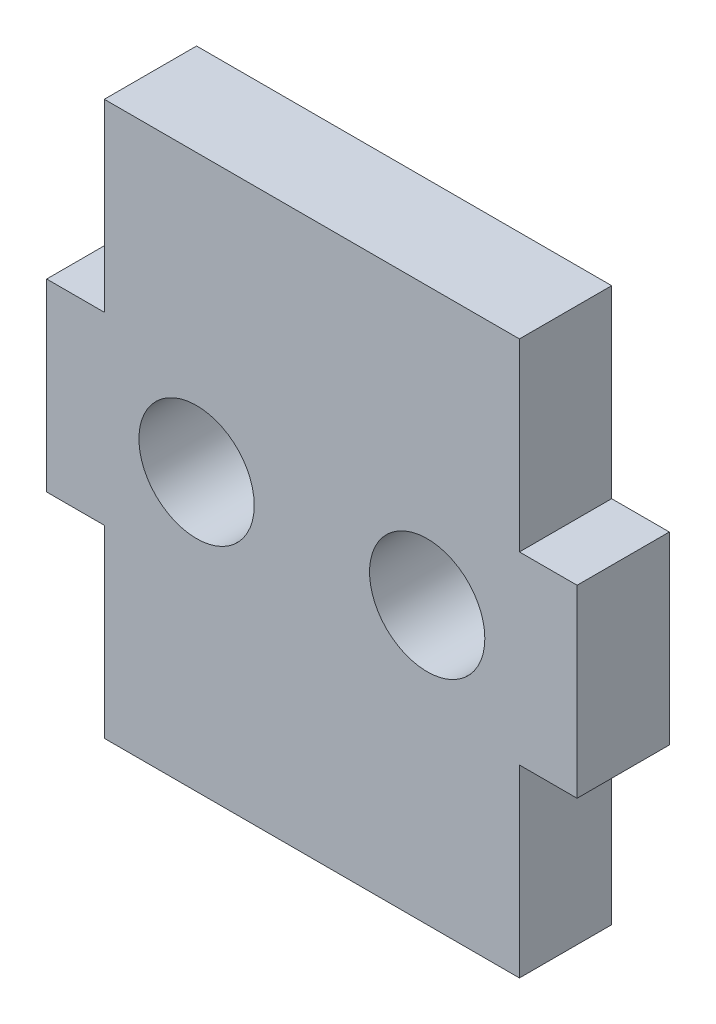
ISO-10303-21;
HEADER;
FILE_DESCRIPTION(('STEP AP214'),'2;1');
FILE_NAME('part.step','',(''),(''),'','','');
FILE_SCHEMA(('AUTOMOTIVE_DESIGN { 1 0 10303 214 1 1 1 1 }'));
ENDSEC;
DATA;
#1=APPLICATION_CONTEXT('core data for automotive mechanical design processes');
#2=APPLICATION_PROTOCOL_DEFINITION('international standard','automotive_design',2000,#1);
#3=PRODUCT_CONTEXT('',#1,'mechanical');
#4=PRODUCT('Part','Part','',(#3));
#5=PRODUCT_RELATED_PRODUCT_CATEGORY('part','',(#4));
#6=PRODUCT_DEFINITION_FORMATION('','',#4);
#7=PRODUCT_DEFINITION_CONTEXT('part definition',#1,'design');
#8=PRODUCT_DEFINITION('design','',#6,#7);
#9=PRODUCT_DEFINITION_SHAPE('','',#8);
#10=(LENGTH_UNIT() NAMED_UNIT(*) SI_UNIT(.MILLI.,.METRE.));
#11=(NAMED_UNIT(*) PLANE_ANGLE_UNIT() SI_UNIT($,.RADIAN.));
#12=(NAMED_UNIT(*) SI_UNIT($,.STERADIAN.) SOLID_ANGLE_UNIT());
#13=UNCERTAINTY_MEASURE_WITH_UNIT(LENGTH_MEASURE(1.E-05),#10,'distance_accuracy_value','');
#14=(GEOMETRIC_REPRESENTATION_CONTEXT(3) GLOBAL_UNCERTAINTY_ASSIGNED_CONTEXT((#13)) GLOBAL_UNIT_ASSIGNED_CONTEXT((#10,
#11,#12)) REPRESENTATION_CONTEXT('',''));
#15=CARTESIAN_POINT('',(0.,0.,0.));
#16=DIRECTION('',(0.,0.,1.));
#17=DIRECTION('',(1.,0.,0.));
#18=AXIS2_PLACEMENT_3D('',#15,#16,#17);
#19=CARTESIAN_POINT('',(0.,0.,2.));
#20=DIRECTION('',(0.,0.,1.));
#21=DIRECTION('',(1.,0.,0.));
#22=AXIS2_PLACEMENT_3D('',#19,#20,#21);
#23=PLANE('',#22);
#24=CARTESIAN_POINT('',(1959.17680872112,1460.88411595094,2.));
#25=DIRECTION('',(0.,0.,1.));
#26=DIRECTION('',(1.,0.,0.));
#27=AXIS2_PLACEMENT_3D('',#24,#25,#26);
#28=CIRCLE('',#27,1.24999999999997);
#29=CARTESIAN_POINT('',(1960.42680872112,1460.88411595094,2.));
#30=VERTEX_POINT('',#29);
#31=EDGE_CURVE('E158',#30,#30,#28,.T.);
#32=ORIENTED_EDGE('',*,*,#31,.F.);
#33=EDGE_LOOP('',(#32));
#34=FACE_BOUND('',#33,.T.);
#35=DIRECTION('',(-2.22044604925031E-13,-1.,0.));
#36=VECTOR('',#35,1.);
#37=CARTESIAN_POINT('',(1952.17680872112,1458.88411595094,2.));
#38=LINE('',#37,#36);
#39=CARTESIAN_POINT('',(1952.17680872112,1458.88411595094,2.));
#40=VERTEX_POINT('',#39);
#41=CARTESIAN_POINT('',(1952.17680872112,1454.88411595094,2.));
#42=VERTEX_POINT('',#41);
#43=EDGE_CURVE('E177',#40,#42,#38,.T.);
#44=ORIENTED_EDGE('',*,*,#43,.T.);
#45=DIRECTION('',(1.,0.,0.));
#46=VECTOR('',#45,1.);
#47=CARTESIAN_POINT('',(1952.17680872112,1454.88411595094,2.));
#48=LINE('',#47,#46);
#49=CARTESIAN_POINT('',(1961.17680872112,1454.88411595094,2.));
#50=VERTEX_POINT('',#49);
#51=EDGE_CURVE('E105',#42,#50,#48,.T.);
#52=ORIENTED_EDGE('',*,*,#51,.T.);
#53=DIRECTION('',(0.,1.,0.));
#54=VECTOR('',#53,1.);
#55=CARTESIAN_POINT('',(1961.17680872112,1458.88411595094,2.));
#56=LINE('',#55,#54);
#57=CARTESIAN_POINT('',(1961.17680872112,1458.88411595094,2.));
#58=VERTEX_POINT('',#57);
#59=EDGE_CURVE('E204',#50,#58,#56,.T.);
#60=ORIENTED_EDGE('',*,*,#59,.T.);
#61=DIRECTION('',(1.,0.,0.));
#62=VECTOR('',#61,1.);
#63=CARTESIAN_POINT('',(1961.17680872112,1458.88411595094,2.));
#64=LINE('',#63,#62);
#65=CARTESIAN_POINT('',(1962.42680872112,1458.88411595094,2.));
#66=VERTEX_POINT('',#65);
#67=EDGE_CURVE('E223',#58,#66,#64,.T.);
#68=ORIENTED_EDGE('',*,*,#67,.T.);
#69=DIRECTION('',(1.11022302462522E-13,1.,0.));
#70=VECTOR('',#69,1.);
#71=CARTESIAN_POINT('',(1962.42680872112,1462.88411595094,2.));
#72=LINE('',#71,#70);
#73=CARTESIAN_POINT('',(1962.42680872112,1462.88411595094,2.));
#74=VERTEX_POINT('',#73);
#75=EDGE_CURVE('E220',#66,#74,#72,.T.);
#76=ORIENTED_EDGE('',*,*,#75,.T.);
#77=DIRECTION('',(-1.,0.,0.));
#78=VECTOR('',#77,1.);
#79=CARTESIAN_POINT('',(1961.17680872112,1462.88411595094,2.));
#80=LINE('',#79,#78);
#81=CARTESIAN_POINT('',(1961.17680872112,1462.88411595094,2.));
#82=VERTEX_POINT('',#81);
#83=EDGE_CURVE('E222',#74,#82,#80,.T.);
#84=ORIENTED_EDGE('',*,*,#83,.T.);
#85=DIRECTION('',(0.,1.,0.));
#86=VECTOR('',#85,1.);
#87=CARTESIAN_POINT('',(1961.17680872112,1462.88411595094,2.));
#88=LINE('',#87,#86);
#89=CARTESIAN_POINT('',(1961.17680872112,1466.88411595094,2.));
#90=VERTEX_POINT('',#89);
#91=EDGE_CURVE('E225',#82,#90,#88,.T.);
#92=ORIENTED_EDGE('',*,*,#91,.T.);
#93=DIRECTION('',(-1.,0.,0.));
#94=VECTOR('',#93,1.);
#95=CARTESIAN_POINT('',(1961.17680872112,1466.88411595094,2.));
#96=LINE('',#95,#94);
#97=CARTESIAN_POINT('',(1952.17680872112,1466.88411595094,2.));
#98=VERTEX_POINT('',#97);
#99=EDGE_CURVE('E231',#90,#98,#96,.T.);
#100=ORIENTED_EDGE('',*,*,#99,.T.);
#101=DIRECTION('',(0.,-1.,0.));
#102=VECTOR('',#101,1.);
#103=CARTESIAN_POINT('',(1952.17680872112,1462.88411595094,2.));
#104=LINE('',#103,#102);
#105=CARTESIAN_POINT('',(1952.17680872112,1462.88411595094,2.));
#106=VERTEX_POINT('',#105);
#107=EDGE_CURVE('E136',#98,#106,#104,.T.);
#108=ORIENTED_EDGE('',*,*,#107,.T.);
#109=DIRECTION('',(-1.,0.,0.));
#110=VECTOR('',#109,1.);
#111=CARTESIAN_POINT('',(1952.17680872112,1462.88411595094,2.));
#112=LINE('',#111,#110);
#113=CARTESIAN_POINT('',(1950.92680872112,1462.88411595094,2.));
#114=VERTEX_POINT('',#113);
#115=EDGE_CURVE('E130',#106,#114,#112,.T.);
#116=ORIENTED_EDGE('',*,*,#115,.T.);
#117=DIRECTION('',(0.,-1.,0.));
#118=VECTOR('',#117,1.);
#119=CARTESIAN_POINT('',(1950.92680872112,1462.88411595094,2.));
#120=LINE('',#119,#118);
#121=CARTESIAN_POINT('',(1950.92680872112,1458.88411595094,2.));
#122=VERTEX_POINT('',#121);
#123=EDGE_CURVE('E134',#114,#122,#120,.T.);
#124=ORIENTED_EDGE('',*,*,#123,.T.);
#125=DIRECTION('',(1.,0.,0.));
#126=VECTOR('',#125,1.);
#127=CARTESIAN_POINT('',(1952.17680872112,1458.88411595094,2.));
#128=LINE('',#127,#126);
#129=EDGE_CURVE('E50',#122,#40,#128,.T.);
#130=ORIENTED_EDGE('',*,*,#129,.T.);
#131=EDGE_LOOP('',(#44,#52,#60,#68,#76,#84,#92,#100,#108,#116,#124,#130));
#132=FACE_BOUND('',#131,.T.);
#133=CARTESIAN_POINT('',(1954.17680872112,1460.88411595095,2.));
#134=DIRECTION('',(0.,0.,1.));
#135=DIRECTION('',(1.,0.,0.));
#136=AXIS2_PLACEMENT_3D('',#133,#134,#135);
#137=CIRCLE('',#136,1.24999999999997);
#138=CARTESIAN_POINT('',(1955.42680872112,1460.88411595095,2.));
#139=VERTEX_POINT('',#138);
#140=EDGE_CURVE('E274',#139,#139,#137,.T.);
#141=ORIENTED_EDGE('',*,*,#140,.F.);
#142=EDGE_LOOP('',(#141));
#143=FACE_BOUND('',#142,.T.);
#144=ADVANCED_FACE('F33',(#34,#132,#143),#23,.T.);
#145=CARTESIAN_POINT('',(0.,0.,0.));
#146=DIRECTION('',(0.,0.,1.));
#147=DIRECTION('',(1.,0.,0.));
#148=AXIS2_PLACEMENT_3D('',#145,#146,#147);
#149=PLANE('',#148);
#150=CARTESIAN_POINT('',(1959.17680872112,1460.88411595094,0.));
#151=DIRECTION('',(0.,0.,1.));
#152=DIRECTION('',(1.,0.,0.));
#153=AXIS2_PLACEMENT_3D('',#150,#151,#152);
#154=CIRCLE('',#153,1.24999999999997);
#155=CARTESIAN_POINT('',(1960.42680872112,1460.88411595094,0.));
#156=VERTEX_POINT('',#155);
#157=EDGE_CURVE('E279',#156,#156,#154,.T.);
#158=ORIENTED_EDGE('',*,*,#157,.T.);
#159=EDGE_LOOP('',(#158));
#160=FACE_BOUND('',#159,.T.);
#161=DIRECTION('',(-2.22044604925031E-13,-1.,0.));
#162=VECTOR('',#161,1.);
#163=CARTESIAN_POINT('',(1952.17680872112,1458.88411595094,0.));
#164=LINE('',#163,#162);
#165=CARTESIAN_POINT('',(1952.17680872112,1458.88411595094,0.));
#166=VERTEX_POINT('',#165);
#167=CARTESIAN_POINT('',(1952.17680872112,1454.88411595094,0.));
#168=VERTEX_POINT('',#167);
#169=EDGE_CURVE('E154',#166,#168,#164,.T.);
#170=ORIENTED_EDGE('',*,*,#169,.F.);
#171=DIRECTION('',(1.,0.,0.));
#172=VECTOR('',#171,1.);
#173=CARTESIAN_POINT('',(1952.17680872112,1458.88411595094,0.));
#174=LINE('',#173,#172);
#175=CARTESIAN_POINT('',(1950.92680872112,1458.88411595094,0.));
#176=VERTEX_POINT('',#175);
#177=EDGE_CURVE('E97',#176,#166,#174,.T.);
#178=ORIENTED_EDGE('',*,*,#177,.F.);
#179=DIRECTION('',(0.,-1.,0.));
#180=VECTOR('',#179,1.);
#181=CARTESIAN_POINT('',(1950.92680872112,1462.88411595094,0.));
#182=LINE('',#181,#180);
#183=CARTESIAN_POINT('',(1950.92680872112,1462.88411595094,0.));
#184=VERTEX_POINT('',#183);
#185=EDGE_CURVE('E91',#184,#176,#182,.T.);
#186=ORIENTED_EDGE('',*,*,#185,.F.);
#187=DIRECTION('',(-1.,0.,0.));
#188=VECTOR('',#187,1.);
#189=CARTESIAN_POINT('',(1952.17680872112,1462.88411595094,0.));
#190=LINE('',#189,#188);
#191=CARTESIAN_POINT('',(1952.17680872112,1462.88411595094,0.));
#192=VERTEX_POINT('',#191);
#193=EDGE_CURVE('E144',#192,#184,#190,.T.);
#194=ORIENTED_EDGE('',*,*,#193,.F.);
#195=DIRECTION('',(0.,-1.,0.));
#196=VECTOR('',#195,1.);
#197=CARTESIAN_POINT('',(1952.17680872112,1462.88411595094,0.));
#198=LINE('',#197,#196);
#199=CARTESIAN_POINT('',(1952.17680872112,1466.88411595094,0.));
#200=VERTEX_POINT('',#199);
#201=EDGE_CURVE('E172',#200,#192,#198,.T.);
#202=ORIENTED_EDGE('',*,*,#201,.F.);
#203=DIRECTION('',(-1.,0.,0.));
#204=VECTOR('',#203,1.);
#205=CARTESIAN_POINT('',(1961.17680872112,1466.88411595094,0.));
#206=LINE('',#205,#204);
#207=CARTESIAN_POINT('',(1961.17680872112,1466.88411595094,0.));
#208=VERTEX_POINT('',#207);
#209=EDGE_CURVE('E170',#208,#200,#206,.T.);
#210=ORIENTED_EDGE('',*,*,#209,.F.);
#211=DIRECTION('',(0.,1.,0.));
#212=VECTOR('',#211,1.);
#213=CARTESIAN_POINT('',(1961.17680872112,1462.88411595094,0.));
#214=LINE('',#213,#212);
#215=CARTESIAN_POINT('',(1961.17680872112,1462.88411595094,0.));
#216=VERTEX_POINT('',#215);
#217=EDGE_CURVE('E168',#216,#208,#214,.T.);
#218=ORIENTED_EDGE('',*,*,#217,.F.);
#219=DIRECTION('',(-1.,0.,0.));
#220=VECTOR('',#219,1.);
#221=CARTESIAN_POINT('',(1961.17680872112,1462.88411595094,0.));
#222=LINE('',#221,#220);
#223=CARTESIAN_POINT('',(1962.42680872112,1462.88411595094,0.));
#224=VERTEX_POINT('',#223);
#225=EDGE_CURVE('E166',#224,#216,#222,.T.);
#226=ORIENTED_EDGE('',*,*,#225,.F.);
#227=DIRECTION('',(1.11022302462522E-13,1.,0.));
#228=VECTOR('',#227,1.);
#229=CARTESIAN_POINT('',(1962.42680872112,1462.88411595094,0.));
#230=LINE('',#229,#228);
#231=CARTESIAN_POINT('',(1962.42680872112,1458.88411595094,0.));
#232=VERTEX_POINT('',#231);
#233=EDGE_CURVE('E164',#232,#224,#230,.T.);
#234=ORIENTED_EDGE('',*,*,#233,.F.);
#235=DIRECTION('',(1.,0.,0.));
#236=VECTOR('',#235,1.);
#237=CARTESIAN_POINT('',(1961.17680872112,1458.88411595094,0.));
#238=LINE('',#237,#236);
#239=CARTESIAN_POINT('',(1961.17680872112,1458.88411595094,0.));
#240=VERTEX_POINT('',#239);
#241=EDGE_CURVE('E162',#240,#232,#238,.T.);
#242=ORIENTED_EDGE('',*,*,#241,.F.);
#243=DIRECTION('',(0.,1.,0.));
#244=VECTOR('',#243,1.);
#245=CARTESIAN_POINT('',(1961.17680872112,1458.88411595094,0.));
#246=LINE('',#245,#244);
#247=CARTESIAN_POINT('',(1961.17680872112,1454.88411595094,0.));
#248=VERTEX_POINT('',#247);
#249=EDGE_CURVE('E160',#248,#240,#246,.T.);
#250=ORIENTED_EDGE('',*,*,#249,.F.);
#251=DIRECTION('',(1.,0.,0.));
#252=VECTOR('',#251,1.);
#253=CARTESIAN_POINT('',(1952.17680872112,1454.88411595094,0.));
#254=LINE('',#253,#252);
#255=EDGE_CURVE('E157',#168,#248,#254,.T.);
#256=ORIENTED_EDGE('',*,*,#255,.F.);
#257=EDGE_LOOP('',(#170,#178,#186,#194,#202,#210,#218,#226,#234,#242,#250,#256));
#258=FACE_BOUND('',#257,.T.);
#259=CARTESIAN_POINT('',(1954.17680872112,1460.88411595095,0.));
#260=DIRECTION('',(0.,0.,1.));
#261=DIRECTION('',(1.,0.,0.));
#262=AXIS2_PLACEMENT_3D('',#259,#260,#261);
#263=CIRCLE('',#262,1.24999999999997);
#264=CARTESIAN_POINT('',(1955.42680872112,1460.88411595095,0.));
#265=VERTEX_POINT('',#264);
#266=EDGE_CURVE('E277',#265,#265,#263,.T.);
#267=ORIENTED_EDGE('',*,*,#266,.T.);
#268=EDGE_LOOP('',(#267));
#269=FACE_BOUND('',#268,.T.);
#270=ADVANCED_FACE('F208',(#160,#258,#269),#149,.F.);
#271=CARTESIAN_POINT('',(1952.17680872112,1458.88411595094,2.));
#272=DIRECTION('',(1.,-2.22044604925031E-13,0.));
#273=DIRECTION('',(2.22044604925031E-13,1.,0.));
#274=AXIS2_PLACEMENT_3D('',#271,#272,#273);
#275=PLANE('',#274);
#276=ORIENTED_EDGE('',*,*,#169,.T.);
#277=DIRECTION('',(0.,0.,-1.));
#278=VECTOR('',#277,1.);
#279=CARTESIAN_POINT('',(1952.17680872112,1454.88411595094,2.));
#280=LINE('',#279,#278);
#281=EDGE_CURVE('E11',#42,#168,#280,.T.);
#282=ORIENTED_EDGE('',*,*,#281,.F.);
#283=ORIENTED_EDGE('',*,*,#43,.F.);
#284=DIRECTION('',(0.,0.,-1.));
#285=VECTOR('',#284,1.);
#286=CARTESIAN_POINT('',(1952.17680872112,1458.88411595094,2.));
#287=LINE('',#286,#285);
#288=EDGE_CURVE('E150',#40,#166,#287,.T.);
#289=ORIENTED_EDGE('',*,*,#288,.T.);
#290=EDGE_LOOP('',(#276,#282,#283,#289));
#291=FACE_BOUND('',#290,.T.);
#292=ADVANCED_FACE('F35',(#291),#275,.F.);
#293=CARTESIAN_POINT('',(1952.17680872112,1454.88411595094,2.));
#294=DIRECTION('',(0.,1.,0.));
#295=DIRECTION('',(0.,0.,1.));
#296=AXIS2_PLACEMENT_3D('',#293,#294,#295);
#297=PLANE('',#296);
#298=ORIENTED_EDGE('',*,*,#255,.T.);
#299=DIRECTION('',(0.,0.,-1.));
#300=VECTOR('',#299,1.);
#301=CARTESIAN_POINT('',(1961.17680872112,1454.88411595094,2.));
#302=LINE('',#301,#300);
#303=EDGE_CURVE('E42',#50,#248,#302,.T.);
#304=ORIENTED_EDGE('',*,*,#303,.F.);
#305=ORIENTED_EDGE('',*,*,#51,.F.);
#306=ORIENTED_EDGE('',*,*,#281,.T.);
#307=EDGE_LOOP('',(#298,#304,#305,#306));
#308=FACE_BOUND('',#307,.T.);
#309=ADVANCED_FACE('F372',(#308),#297,.F.);
#310=CARTESIAN_POINT('',(1961.17680872112,1458.88411595094,2.));
#311=DIRECTION('',(-1.,0.,0.));
#312=DIRECTION('',(0.,0.,1.));
#313=AXIS2_PLACEMENT_3D('',#310,#311,#312);
#314=PLANE('',#313);
#315=ORIENTED_EDGE('',*,*,#249,.T.);
#316=DIRECTION('',(0.,0.,-1.));
#317=VECTOR('',#316,1.);
#318=CARTESIAN_POINT('',(1961.17680872112,1458.88411595094,2.));
#319=LINE('',#318,#317);
#320=EDGE_CURVE('E196',#58,#240,#319,.T.);
#321=ORIENTED_EDGE('',*,*,#320,.F.);
#322=ORIENTED_EDGE('',*,*,#59,.F.);
#323=ORIENTED_EDGE('',*,*,#303,.T.);
#324=EDGE_LOOP('',(#315,#321,#322,#323));
#325=FACE_BOUND('',#324,.T.);
#326=ADVANCED_FACE('F202',(#325),#314,.F.);
#327=CARTESIAN_POINT('',(1961.17680872112,1458.88411595094,2.));
#328=DIRECTION('',(0.,1.,0.));
#329=DIRECTION('',(0.,0.,1.));
#330=AXIS2_PLACEMENT_3D('',#327,#328,#329);
#331=PLANE('',#330);
#332=ORIENTED_EDGE('',*,*,#241,.T.);
#333=DIRECTION('',(0.,0.,-1.));
#334=VECTOR('',#333,1.);
#335=CARTESIAN_POINT('',(1962.42680872112,1458.88411595094,2.));
#336=LINE('',#335,#334);
#337=EDGE_CURVE('E193',#66,#232,#336,.T.);
#338=ORIENTED_EDGE('',*,*,#337,.F.);
#339=ORIENTED_EDGE('',*,*,#67,.F.);
#340=ORIENTED_EDGE('',*,*,#320,.T.);
#341=EDGE_LOOP('',(#332,#338,#339,#340));
#342=FACE_BOUND('',#341,.T.);
#343=ADVANCED_FACE('F214',(#342),#331,.F.);
#344=CARTESIAN_POINT('',(1962.42680872112,1462.88411595094,2.));
#345=DIRECTION('',(-1.,1.11022302462522E-13,0.));
#346=DIRECTION('',(-1.11022302462522E-13,-1.,0.));
#347=AXIS2_PLACEMENT_3D('',#344,#345,#346);
#348=PLANE('',#347);
#349=ORIENTED_EDGE('',*,*,#233,.T.);
#350=DIRECTION('',(0.,0.,-1.));
#351=VECTOR('',#350,1.);
#352=CARTESIAN_POINT('',(1962.42680872112,1462.88411595094,2.));
#353=LINE('',#352,#351);
#354=EDGE_CURVE('E190',#74,#224,#353,.T.);
#355=ORIENTED_EDGE('',*,*,#354,.F.);
#356=ORIENTED_EDGE('',*,*,#75,.F.);
#357=ORIENTED_EDGE('',*,*,#337,.T.);
#358=EDGE_LOOP('',(#349,#355,#356,#357));
#359=FACE_BOUND('',#358,.T.);
#360=ADVANCED_FACE('F218',(#359),#348,.F.);
#361=CARTESIAN_POINT('',(1961.17680872112,1462.88411595094,2.));
#362=DIRECTION('',(0.,-1.,0.));
#363=DIRECTION('',(0.,0.,-1.));
#364=AXIS2_PLACEMENT_3D('',#361,#362,#363);
#365=PLANE('',#364);
#366=ORIENTED_EDGE('',*,*,#225,.T.);
#367=DIRECTION('',(0.,0.,-1.));
#368=VECTOR('',#367,1.);
#369=CARTESIAN_POINT('',(1961.17680872112,1462.88411595094,2.));
#370=LINE('',#369,#368);
#371=EDGE_CURVE('E187',#82,#216,#370,.T.);
#372=ORIENTED_EDGE('',*,*,#371,.F.);
#373=ORIENTED_EDGE('',*,*,#83,.F.);
#374=ORIENTED_EDGE('',*,*,#354,.T.);
#375=EDGE_LOOP('',(#366,#372,#373,#374));
#376=FACE_BOUND('',#375,.T.);
#377=ADVANCED_FACE('F337',(#376),#365,.F.);
#378=CARTESIAN_POINT('',(1961.17680872112,1462.88411595094,2.));
#379=DIRECTION('',(-1.,0.,0.));
#380=DIRECTION('',(0.,0.,1.));
#381=AXIS2_PLACEMENT_3D('',#378,#379,#380);
#382=PLANE('',#381);
#383=ORIENTED_EDGE('',*,*,#217,.T.);
#384=DIRECTION('',(0.,0.,-1.));
#385=VECTOR('',#384,1.);
#386=CARTESIAN_POINT('',(1961.17680872112,1466.88411595094,2.));
#387=LINE('',#386,#385);
#388=EDGE_CURVE('E184',#90,#208,#387,.T.);
#389=ORIENTED_EDGE('',*,*,#388,.F.);
#390=ORIENTED_EDGE('',*,*,#91,.F.);
#391=ORIENTED_EDGE('',*,*,#371,.T.);
#392=EDGE_LOOP('',(#383,#389,#390,#391));
#393=FACE_BOUND('',#392,.T.);
#394=ADVANCED_FACE('F328',(#393),#382,.F.);
#395=CARTESIAN_POINT('',(1961.17680872112,1466.88411595094,2.));
#396=DIRECTION('',(0.,-1.,0.));
#397=DIRECTION('',(0.,0.,-1.));
#398=AXIS2_PLACEMENT_3D('',#395,#396,#397);
#399=PLANE('',#398);
#400=ORIENTED_EDGE('',*,*,#209,.T.);
#401=DIRECTION('',(0.,0.,-1.));
#402=VECTOR('',#401,1.);
#403=CARTESIAN_POINT('',(1952.17680872112,1466.88411595094,2.));
#404=LINE('',#403,#402);
#405=EDGE_CURVE('E181',#98,#200,#404,.T.);
#406=ORIENTED_EDGE('',*,*,#405,.F.);
#407=ORIENTED_EDGE('',*,*,#99,.F.);
#408=ORIENTED_EDGE('',*,*,#388,.T.);
#409=EDGE_LOOP('',(#400,#406,#407,#408));
#410=FACE_BOUND('',#409,.T.);
#411=ADVANCED_FACE('F237',(#410),#399,.F.);
#412=CARTESIAN_POINT('',(1952.17680872112,1462.88411595094,2.));
#413=DIRECTION('',(1.,0.,0.));
#414=DIRECTION('',(0.,0.,-1.));
#415=AXIS2_PLACEMENT_3D('',#412,#413,#414);
#416=PLANE('',#415);
#417=ORIENTED_EDGE('',*,*,#201,.T.);
#418=DIRECTION('',(0.,0.,-1.));
#419=VECTOR('',#418,1.);
#420=CARTESIAN_POINT('',(1952.17680872112,1462.88411595094,2.));
#421=LINE('',#420,#419);
#422=EDGE_CURVE('E145',#106,#192,#421,.T.);
#423=ORIENTED_EDGE('',*,*,#422,.F.);
#424=ORIENTED_EDGE('',*,*,#107,.F.);
#425=ORIENTED_EDGE('',*,*,#405,.T.);
#426=EDGE_LOOP('',(#417,#423,#424,#425));
#427=FACE_BOUND('',#426,.T.);
#428=ADVANCED_FACE('F241',(#427),#416,.F.);
#429=CARTESIAN_POINT('',(1952.17680872112,1462.88411595094,2.));
#430=DIRECTION('',(0.,-1.,0.));
#431=DIRECTION('',(0.,0.,-1.));
#432=AXIS2_PLACEMENT_3D('',#429,#430,#431);
#433=PLANE('',#432);
#434=ORIENTED_EDGE('',*,*,#193,.T.);
#435=DIRECTION('',(0.,0.,-1.));
#436=VECTOR('',#435,1.);
#437=CARTESIAN_POINT('',(1950.92680872112,1462.88411595094,2.));
#438=LINE('',#437,#436);
#439=EDGE_CURVE('E141',#114,#184,#438,.T.);
#440=ORIENTED_EDGE('',*,*,#439,.F.);
#441=ORIENTED_EDGE('',*,*,#115,.F.);
#442=ORIENTED_EDGE('',*,*,#422,.T.);
#443=EDGE_LOOP('',(#434,#440,#441,#442));
#444=FACE_BOUND('',#443,.T.);
#445=ADVANCED_FACE('F142',(#444),#433,.F.);
#446=CARTESIAN_POINT('',(1950.92680872112,1462.88411595094,2.));
#447=DIRECTION('',(1.,0.,0.));
#448=DIRECTION('',(0.,0.,-1.));
#449=AXIS2_PLACEMENT_3D('',#446,#447,#448);
#450=PLANE('',#449);
#451=ORIENTED_EDGE('',*,*,#185,.T.);
#452=DIRECTION('',(0.,0.,-1.));
#453=VECTOR('',#452,1.);
#454=CARTESIAN_POINT('',(1950.92680872112,1458.88411595094,2.));
#455=LINE('',#454,#453);
#456=EDGE_CURVE('E146',#122,#176,#455,.T.);
#457=ORIENTED_EDGE('',*,*,#456,.F.);
#458=ORIENTED_EDGE('',*,*,#123,.F.);
#459=ORIENTED_EDGE('',*,*,#439,.T.);
#460=EDGE_LOOP('',(#451,#457,#458,#459));
#461=FACE_BOUND('',#460,.T.);
#462=ADVANCED_FACE('F148',(#461),#450,.F.);
#463=CARTESIAN_POINT('',(1952.17680872112,1458.88411595094,2.));
#464=DIRECTION('',(0.,1.,0.));
#465=DIRECTION('',(0.,0.,1.));
#466=AXIS2_PLACEMENT_3D('',#463,#464,#465);
#467=PLANE('',#466);
#468=ORIENTED_EDGE('',*,*,#177,.T.);
#469=ORIENTED_EDGE('',*,*,#288,.F.);
#470=ORIENTED_EDGE('',*,*,#129,.F.);
#471=ORIENTED_EDGE('',*,*,#456,.T.);
#472=EDGE_LOOP('',(#468,#469,#470,#471));
#473=FACE_BOUND('',#472,.T.);
#474=ADVANCED_FACE('F245',(#473),#467,.F.);
#475=CARTESIAN_POINT('',(1959.17680872112,1460.88411595094,2.));
#476=DIRECTION('',(0.,0.,-1.));
#477=DIRECTION('',(-1.,0.,0.));
#478=AXIS2_PLACEMENT_3D('',#475,#476,#477);
#479=CYLINDRICAL_SURFACE('',#478,1.24999999999997);
#480=ORIENTED_EDGE('',*,*,#31,.T.);
#481=EDGE_LOOP('',(#480));
#482=FACE_BOUND('',#481,.T.);
#483=ORIENTED_EDGE('',*,*,#157,.F.);
#484=EDGE_LOOP('',(#483));
#485=FACE_BOUND('',#484,.T.);
#486=ADVANCED_FACE('F247',(#482,#485),#479,.F.);
#487=CARTESIAN_POINT('',(1954.17680872112,1460.88411595095,2.));
#488=DIRECTION('',(0.,0.,-1.));
#489=DIRECTION('',(-1.,0.,0.));
#490=AXIS2_PLACEMENT_3D('',#487,#488,#489);
#491=CYLINDRICAL_SURFACE('',#490,1.24999999999997);
#492=ORIENTED_EDGE('',*,*,#140,.T.);
#493=EDGE_LOOP('',(#492));
#494=FACE_BOUND('',#493,.T.);
#495=ORIENTED_EDGE('',*,*,#266,.F.);
#496=EDGE_LOOP('',(#495));
#497=FACE_BOUND('',#496,.T.);
#498=ADVANCED_FACE('F253',(#494,#497),#491,.F.);
#499=CLOSED_SHELL('',(#144,#270,#292,#309,#326,#343,#360,#377,#394,#411,#428,#445,#462,#474,
#486,#498));
#500=MANIFOLD_SOLID_BREP('B2',#499);
#501=ADVANCED_BREP_SHAPE_REPRESENTATION('',(#18,#500),#14);
#502=SHAPE_DEFINITION_REPRESENTATION(#9,#501);
ENDSEC;
END-ISO-10303-21;
